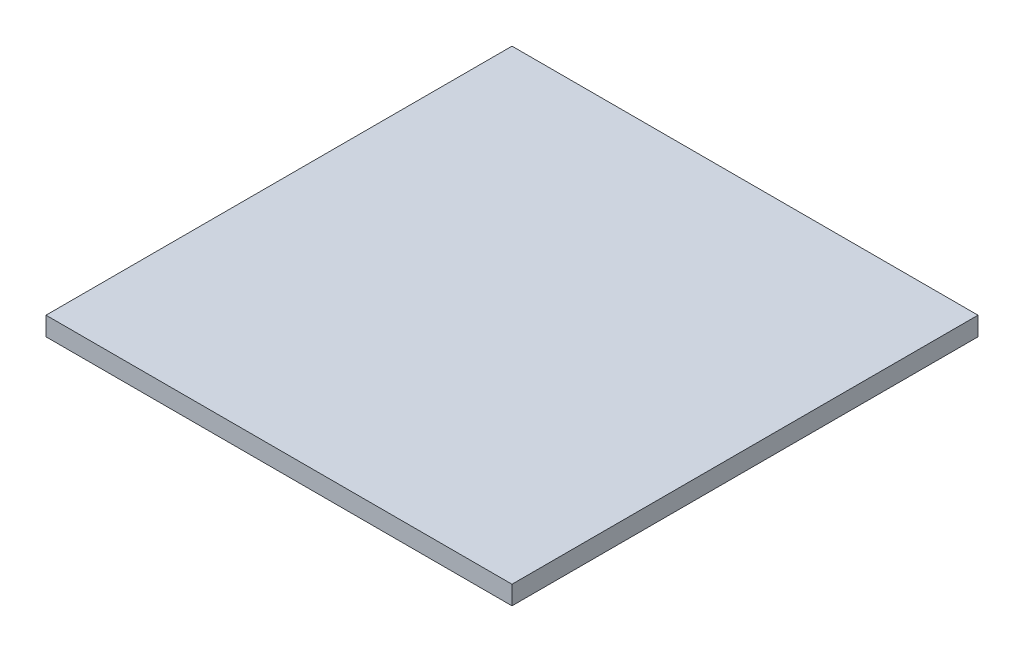
ISO-10303-21;
HEADER;
FILE_DESCRIPTION(('STEP AP214'),'2;1');
FILE_NAME('part.step','',(''),(''),'','','');
FILE_SCHEMA(('AUTOMOTIVE_DESIGN { 1 0 10303 214 1 1 1 1 }'));
ENDSEC;
DATA;
#1=APPLICATION_CONTEXT('core data for automotive mechanical design processes');
#2=APPLICATION_PROTOCOL_DEFINITION('international standard','automotive_design',2000,#1);
#3=PRODUCT_CONTEXT('',#1,'mechanical');
#4=PRODUCT('Part','Part','',(#3));
#5=PRODUCT_RELATED_PRODUCT_CATEGORY('part','',(#4));
#6=PRODUCT_DEFINITION_FORMATION('','',#4);
#7=PRODUCT_DEFINITION_CONTEXT('part definition',#1,'design');
#8=PRODUCT_DEFINITION('design','',#6,#7);
#9=PRODUCT_DEFINITION_SHAPE('','',#8);
#10=(LENGTH_UNIT() NAMED_UNIT(*) SI_UNIT(.MILLI.,.METRE.));
#11=(NAMED_UNIT(*) PLANE_ANGLE_UNIT() SI_UNIT($,.RADIAN.));
#12=(NAMED_UNIT(*) SI_UNIT($,.STERADIAN.) SOLID_ANGLE_UNIT());
#13=UNCERTAINTY_MEASURE_WITH_UNIT(LENGTH_MEASURE(1.E-05),#10,'distance_accuracy_value','');
#14=(GEOMETRIC_REPRESENTATION_CONTEXT(3) GLOBAL_UNCERTAINTY_ASSIGNED_CONTEXT((#13)) GLOBAL_UNIT_ASSIGNED_CONTEXT((#10,
#11,#12)) REPRESENTATION_CONTEXT('',''));
#15=CARTESIAN_POINT('',(0.,0.,0.));
#16=DIRECTION('',(0.,0.,1.));
#17=DIRECTION('',(1.,0.,0.));
#18=AXIS2_PLACEMENT_3D('',#15,#16,#17);
#19=CARTESIAN_POINT('',(19.875,-0.8,39.75));
#20=DIRECTION('',(-1.,0.,0.));
#21=DIRECTION('',(0.,0.,1.));
#22=AXIS2_PLACEMENT_3D('',#19,#20,#21);
#23=PLANE('',#22);
#24=DIRECTION('',(0.,1.,0.));
#25=VECTOR('',#24,1.);
#26=CARTESIAN_POINT('',(19.875,-0.8,0.));
#27=LINE('',#26,#25);
#28=CARTESIAN_POINT('',(19.875,-0.8,0.));
#29=VERTEX_POINT('',#28);
#30=CARTESIAN_POINT('',(19.875,0.8,0.));
#31=VERTEX_POINT('',#30);
#32=EDGE_CURVE('E102',#29,#31,#27,.T.);
#33=ORIENTED_EDGE('',*,*,#32,.T.);
#34=DIRECTION('',(0.,0.,-1.));
#35=VECTOR('',#34,1.);
#36=CARTESIAN_POINT('',(19.875,0.8,39.75));
#37=LINE('',#36,#35);
#38=CARTESIAN_POINT('',(19.875,0.8,39.75));
#39=VERTEX_POINT('',#38);
#40=EDGE_CURVE('E11',#39,#31,#37,.T.);
#41=ORIENTED_EDGE('',*,*,#40,.F.);
#42=DIRECTION('',(0.,1.,0.));
#43=VECTOR('',#42,1.);
#44=CARTESIAN_POINT('',(19.875,-0.8,39.75));
#45=LINE('',#44,#43);
#46=CARTESIAN_POINT('',(19.875,-0.8,39.75));
#47=VERTEX_POINT('',#46);
#48=EDGE_CURVE('E90',#47,#39,#45,.T.);
#49=ORIENTED_EDGE('',*,*,#48,.F.);
#50=DIRECTION('',(0.,0.,-1.));
#51=VECTOR('',#50,1.);
#52=CARTESIAN_POINT('',(19.875,-0.8,39.75));
#53=LINE('',#52,#51);
#54=EDGE_CURVE('E98',#47,#29,#53,.T.);
#55=ORIENTED_EDGE('',*,*,#54,.T.);
#56=EDGE_LOOP('',(#33,#41,#49,#55));
#57=FACE_BOUND('',#56,.T.);
#58=ADVANCED_FACE('F39',(#57),#23,.F.);
#59=CARTESIAN_POINT('',(-19.875,0.8,39.75));
#60=DIRECTION('',(0.,-1.,0.));
#61=DIRECTION('',(0.,0.,-1.));
#62=AXIS2_PLACEMENT_3D('',#59,#60,#61);
#63=PLANE('',#62);
#64=DIRECTION('',(-1.,0.,0.));
#65=VECTOR('',#64,1.);
#66=CARTESIAN_POINT('',(-19.875,0.8,0.));
#67=LINE('',#66,#65);
#68=CARTESIAN_POINT('',(-19.875,0.8,0.));
#69=VERTEX_POINT('',#68);
#70=EDGE_CURVE('E94',#31,#69,#67,.T.);
#71=ORIENTED_EDGE('',*,*,#70,.T.);
#72=DIRECTION('',(0.,0.,-1.));
#73=VECTOR('',#72,1.);
#74=CARTESIAN_POINT('',(-19.875,0.8,39.75));
#75=LINE('',#74,#73);
#76=CARTESIAN_POINT('',(-19.875,0.8,39.75));
#77=VERTEX_POINT('',#76);
#78=EDGE_CURVE('E47',#77,#69,#75,.T.);
#79=ORIENTED_EDGE('',*,*,#78,.F.);
#80=DIRECTION('',(-1.,0.,0.));
#81=VECTOR('',#80,1.);
#82=CARTESIAN_POINT('',(-19.875,0.8,39.75));
#83=LINE('',#82,#81);
#84=EDGE_CURVE('E85',#39,#77,#83,.T.);
#85=ORIENTED_EDGE('',*,*,#84,.F.);
#86=ORIENTED_EDGE('',*,*,#40,.T.);
#87=EDGE_LOOP('',(#71,#79,#85,#86));
#88=FACE_BOUND('',#87,.T.);
#89=ADVANCED_FACE('F93',(#88),#63,.F.);
#90=CARTESIAN_POINT('',(-19.875,-0.8,39.75));
#91=DIRECTION('',(1.,0.,0.));
#92=DIRECTION('',(0.,0.,-1.));
#93=AXIS2_PLACEMENT_3D('',#90,#91,#92);
#94=PLANE('',#93);
#95=DIRECTION('',(0.,-1.,0.));
#96=VECTOR('',#95,1.);
#97=CARTESIAN_POINT('',(-19.875,-0.8,0.));
#98=LINE('',#97,#96);
#99=CARTESIAN_POINT('',(-19.875,-0.8,0.));
#100=VERTEX_POINT('',#99);
#101=EDGE_CURVE('E72',#69,#100,#98,.T.);
#102=ORIENTED_EDGE('',*,*,#101,.T.);
#103=DIRECTION('',(0.,0.,-1.));
#104=VECTOR('',#103,1.);
#105=CARTESIAN_POINT('',(-19.875,-0.8,39.75));
#106=LINE('',#105,#104);
#107=CARTESIAN_POINT('',(-19.875,-0.8,39.75));
#108=VERTEX_POINT('',#107);
#109=EDGE_CURVE('E95',#108,#100,#106,.T.);
#110=ORIENTED_EDGE('',*,*,#109,.F.);
#111=DIRECTION('',(0.,-1.,0.));
#112=VECTOR('',#111,1.);
#113=CARTESIAN_POINT('',(-19.875,-0.8,39.75));
#114=LINE('',#113,#112);
#115=EDGE_CURVE('E88',#77,#108,#114,.T.);
#116=ORIENTED_EDGE('',*,*,#115,.F.);
#117=ORIENTED_EDGE('',*,*,#78,.T.);
#118=EDGE_LOOP('',(#102,#110,#116,#117));
#119=FACE_BOUND('',#118,.T.);
#120=ADVANCED_FACE('F96',(#119),#94,.F.);
#121=CARTESIAN_POINT('',(-19.875,-0.8,39.75));
#122=DIRECTION('',(0.,1.,0.));
#123=DIRECTION('',(0.,0.,1.));
#124=AXIS2_PLACEMENT_3D('',#121,#122,#123);
#125=PLANE('',#124);
#126=DIRECTION('',(1.,0.,0.));
#127=VECTOR('',#126,1.);
#128=CARTESIAN_POINT('',(-19.875,-0.8,0.));
#129=LINE('',#128,#127);
#130=EDGE_CURVE('E78',#100,#29,#129,.T.);
#131=ORIENTED_EDGE('',*,*,#130,.T.);
#132=ORIENTED_EDGE('',*,*,#54,.F.);
#133=DIRECTION('',(1.,0.,0.));
#134=VECTOR('',#133,1.);
#135=CARTESIAN_POINT('',(-19.875,-0.8,39.75));
#136=LINE('',#135,#134);
#137=EDGE_CURVE('E55',#108,#47,#136,.T.);
#138=ORIENTED_EDGE('',*,*,#137,.F.);
#139=ORIENTED_EDGE('',*,*,#109,.T.);
#140=EDGE_LOOP('',(#131,#132,#138,#139));
#141=FACE_BOUND('',#140,.T.);
#142=ADVANCED_FACE('F109',(#141),#125,.F.);
#143=CARTESIAN_POINT('',(0.,0.,39.75));
#144=DIRECTION('',(0.,0.,-1.));
#145=DIRECTION('',(-1.,0.,0.));
#146=AXIS2_PLACEMENT_3D('',#143,#144,#145);
#147=PLANE('',#146);
#148=ORIENTED_EDGE('',*,*,#48,.T.);
#149=ORIENTED_EDGE('',*,*,#84,.T.);
#150=ORIENTED_EDGE('',*,*,#115,.T.);
#151=ORIENTED_EDGE('',*,*,#137,.T.);
#152=EDGE_LOOP('',(#148,#149,#150,#151));
#153=FACE_BOUND('',#152,.T.);
#154=ADVANCED_FACE('F86',(#153),#147,.F.);
#155=CARTESIAN_POINT('',(0.,0.,0.));
#156=DIRECTION('',(0.,0.,-1.));
#157=DIRECTION('',(-1.,0.,0.));
#158=AXIS2_PLACEMENT_3D('',#155,#156,#157);
#159=PLANE('',#158);
#160=ORIENTED_EDGE('',*,*,#32,.F.);
#161=ORIENTED_EDGE('',*,*,#130,.F.);
#162=ORIENTED_EDGE('',*,*,#101,.F.);
#163=ORIENTED_EDGE('',*,*,#70,.F.);
#164=EDGE_LOOP('',(#160,#161,#162,#163));
#165=FACE_BOUND('',#164,.T.);
#166=ADVANCED_FACE('F112',(#165),#159,.T.);
#167=CLOSED_SHELL('',(#58,#89,#120,#142,#154,#166));
#168=MANIFOLD_SOLID_BREP('B2',#167);
#169=ADVANCED_BREP_SHAPE_REPRESENTATION('',(#18,#168),#14);
#170=SHAPE_DEFINITION_REPRESENTATION(#9,#169);
ENDSEC;
END-ISO-10303-21;
